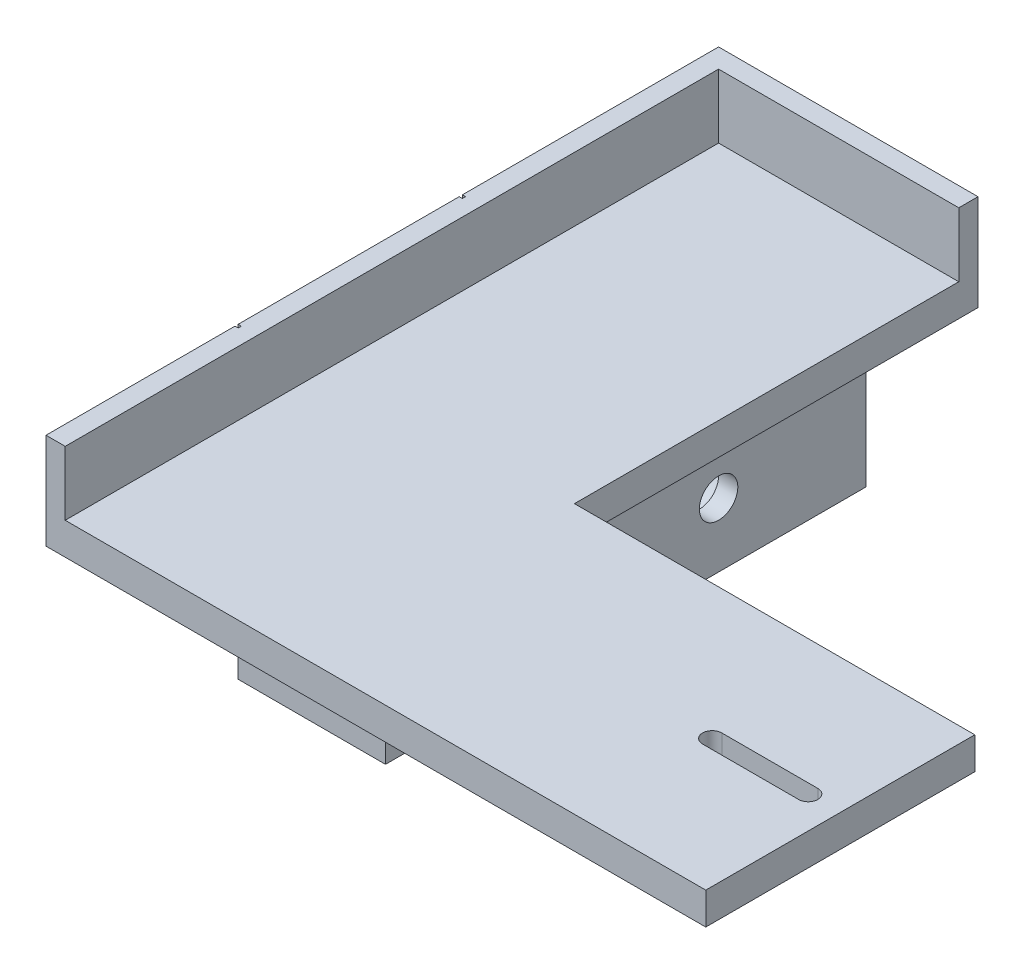
ISO-10303-21;
HEADER;
FILE_DESCRIPTION(('STEP AP214'),'2;1');
FILE_NAME('part.step','',(''),(''),'','','');
FILE_SCHEMA(('AUTOMOTIVE_DESIGN { 1 0 10303 214 1 1 1 1 }'));
ENDSEC;
DATA;
#1=APPLICATION_CONTEXT('core data for automotive mechanical design processes');
#2=APPLICATION_PROTOCOL_DEFINITION('international standard','automotive_design',2000,#1);
#3=PRODUCT_CONTEXT('',#1,'mechanical');
#4=PRODUCT('Part','Part','',(#3));
#5=PRODUCT_RELATED_PRODUCT_CATEGORY('part','',(#4));
#6=PRODUCT_DEFINITION_FORMATION('','',#4);
#7=PRODUCT_DEFINITION_CONTEXT('part definition',#1,'design');
#8=PRODUCT_DEFINITION('design','',#6,#7);
#9=PRODUCT_DEFINITION_SHAPE('','',#8);
#10=(LENGTH_UNIT() NAMED_UNIT(*) SI_UNIT(.MILLI.,.METRE.));
#11=(NAMED_UNIT(*) PLANE_ANGLE_UNIT() SI_UNIT($,.RADIAN.));
#12=(NAMED_UNIT(*) SI_UNIT($,.STERADIAN.) SOLID_ANGLE_UNIT());
#13=UNCERTAINTY_MEASURE_WITH_UNIT(LENGTH_MEASURE(1.E-05),#10,'distance_accuracy_value','');
#14=(GEOMETRIC_REPRESENTATION_CONTEXT(3) GLOBAL_UNCERTAINTY_ASSIGNED_CONTEXT((#13)) GLOBAL_UNIT_ASSIGNED_CONTEXT((#10,
#11,#12)) REPRESENTATION_CONTEXT('',''));
#15=CARTESIAN_POINT('',(0.,0.,0.));
#16=DIRECTION('',(0.,0.,1.));
#17=DIRECTION('',(1.,0.,0.));
#18=AXIS2_PLACEMENT_3D('',#15,#16,#17);
#19=CARTESIAN_POINT('',(-40.4999999999993,0.,-1.12685596148307E-12));
#20=DIRECTION('',(1.,0.,0.));
#21=DIRECTION('',(0.,0.,-1.));
#22=AXIS2_PLACEMENT_3D('',#19,#20,#21);
#23=PLANE('',#22);
#24=CARTESIAN_POINT('',(-40.4999999999977,-23.,-55.9999999999968));
#25=DIRECTION('',(-1.,0.,0.));
#26=DIRECTION('',(0.,0.,1.));
#27=AXIS2_PLACEMENT_3D('',#24,#25,#26);
#28=CIRCLE('',#27,5.);
#29=CARTESIAN_POINT('',(-40.4999999999979,-23.,-50.9999999999968));
#30=VERTEX_POINT('',#29);
#31=EDGE_CURVE('E512',#30,#30,#28,.T.);
#32=ORIENTED_EDGE('',*,*,#31,.F.);
#33=EDGE_LOOP('',(#32));
#34=FACE_BOUND('',#33,.T.);
#35=DIRECTION('',(0.,0.,1.));
#36=VECTOR('',#35,1.);
#37=CARTESIAN_POINT('',(-40.4999999999992,-33.,-4.00000000000008));
#38=LINE('',#37,#36);
#39=CARTESIAN_POINT('',(-40.4999999999974,-33.,-78.9999999999964));
#40=VERTEX_POINT('',#39);
#41=CARTESIAN_POINT('',(-40.4999999999982,-33.,-38.9999999999964));
#42=VERTEX_POINT('',#41);
#43=EDGE_CURVE('E352',#40,#42,#38,.T.);
#44=ORIENTED_EDGE('',*,*,#43,.T.);
#45=DIRECTION('',(0.,-1.,0.));
#46=VECTOR('',#45,1.);
#47=CARTESIAN_POINT('',(-40.4999999999982,15.,-38.9999999999964));
#48=LINE('',#47,#46);
#49=CARTESIAN_POINT('',(-40.4999999999982,-0.500000000000004,-38.9999999999964));
#50=VERTEX_POINT('',#49);
#51=EDGE_CURVE('E374',#50,#42,#48,.T.);
#52=ORIENTED_EDGE('',*,*,#51,.F.);
#53=DIRECTION('',(0.,0.,1.));
#54=VECTOR('',#53,1.);
#55=CARTESIAN_POINT('',(-40.4999999999992,-0.5,-4.00000000000011));
#56=LINE('',#55,#54);
#57=CARTESIAN_POINT('',(-40.4999999999971,-0.500000000000009,-78.9999999999964));
#58=VERTEX_POINT('',#57);
#59=EDGE_CURVE('E289',#58,#50,#56,.T.);
#60=ORIENTED_EDGE('',*,*,#59,.F.);
#61=DIRECTION('',(0.,1.,0.));
#62=VECTOR('',#61,1.);
#63=CARTESIAN_POINT('',(-40.4999999999974,-33.,-78.9999999999964));
#64=LINE('',#63,#62);
#65=EDGE_CURVE('E507',#40,#58,#64,.T.);
#66=ORIENTED_EDGE('',*,*,#65,.F.);
#67=EDGE_LOOP('',(#44,#52,#60,#66));
#68=FACE_BOUND('',#67,.T.);
#69=ADVANCED_FACE('F41',(#34,#68),#23,.F.);
#70=CARTESIAN_POINT('',(0.,0.,0.));
#71=DIRECTION('',(0.,1.,0.));
#72=DIRECTION('',(0.,0.,1.));
#73=AXIS2_PLACEMENT_3D('',#70,#71,#72);
#74=PLANE('',#73);
#75=DIRECTION('',(0.,0.,-1.));
#76=VECTOR('',#75,1.);
#77=CARTESIAN_POINT('',(-39.9999999999992,0.,-4.0000000000001));
#78=LINE('',#77,#76);
#79=CARTESIAN_POINT('',(-39.9999999999992,0.,-4.00000000000007));
#80=VERTEX_POINT('',#79);
#81=CARTESIAN_POINT('',(-39.9999999999982,0.,-38.4999999999964));
#82=VERTEX_POINT('',#81);
#83=EDGE_CURVE('E273',#80,#82,#78,.T.);
#84=ORIENTED_EDGE('',*,*,#83,.F.);
#85=DIRECTION('',(-1.,0.,0.));
#86=VECTOR('',#85,1.);
#87=CARTESIAN_POINT('',(-39.9999999999992,0.,-4.00000000000007));
#88=LINE('',#87,#86);
#89=CARTESIAN_POINT('',(-40.4999999999992,0.,-4.00000000000008));
#90=VERTEX_POINT('',#89);
#91=EDGE_CURVE('E243',#80,#90,#88,.T.);
#92=ORIENTED_EDGE('',*,*,#91,.T.);
#93=DIRECTION('',(0.,0.,1.));
#94=VECTOR('',#93,1.);
#95=CARTESIAN_POINT('',(-40.5,0.,25.9999999999999));
#96=LINE('',#95,#94);
#97=CARTESIAN_POINT('',(-40.4999999999982,0.,-38.4999999999964));
#98=VERTEX_POINT('',#97);
#99=EDGE_CURVE('E354',#98,#90,#96,.T.);
#100=ORIENTED_EDGE('',*,*,#99,.F.);
#101=DIRECTION('',(1.,0.,0.));
#102=VECTOR('',#101,1.);
#103=CARTESIAN_POINT('',(1.07120875350848E-12,0.,-38.4999999999953));
#104=LINE('',#103,#102);
#105=EDGE_CURVE('E276',#98,#82,#104,.T.);
#106=ORIENTED_EDGE('',*,*,#105,.T.);
#107=EDGE_LOOP('',(#84,#92,#100,#106));
#108=FACE_BOUND('',#107,.T.);
#109=ADVANCED_FACE('F275',(#108),#74,.F.);
#110=CARTESIAN_POINT('',(-39.9999999999982,0.,-38.9999999999964));
#111=VERTEX_POINT('',#110);
#112=CARTESIAN_POINT('',(-39.9999999999971,0.,-78.9999999999965));
#113=VERTEX_POINT('',#112);
#114=EDGE_CURVE('E279',#111,#113,#78,.T.);
#115=ORIENTED_EDGE('',*,*,#114,.F.);
#116=DIRECTION('',(-1.,0.,0.));
#117=VECTOR('',#116,1.);
#118=CARTESIAN_POINT('',(1.0851205555021E-12,0.,-38.9999999999953));
#119=LINE('',#118,#117);
#120=CARTESIAN_POINT('',(-40.4999999999982,0.,-38.9999999999964));
#121=VERTEX_POINT('',#120);
#122=EDGE_CURVE('E402',#111,#121,#119,.T.);
#123=ORIENTED_EDGE('',*,*,#122,.T.);
#124=CARTESIAN_POINT('',(-40.4999999999971,0.,-78.9999999999964));
#125=VERTEX_POINT('',#124);
#126=EDGE_CURVE('E355',#125,#121,#96,.T.);
#127=ORIENTED_EDGE('',*,*,#126,.F.);
#128=DIRECTION('',(-1.,0.,0.));
#129=VECTOR('',#128,1.);
#130=CARTESIAN_POINT('',(-39.9999999999971,0.,-78.9999999999964));
#131=LINE('',#130,#129);
#132=EDGE_CURVE('E410',#113,#125,#131,.T.);
#133=ORIENTED_EDGE('',*,*,#132,.F.);
#134=EDGE_LOOP('',(#115,#123,#127,#133));
#135=FACE_BOUND('',#134,.T.);
#136=ADVANCED_FACE('F549',(#135),#74,.F.);
#137=ORIENTED_EDGE('',*,*,#99,.T.);
#138=DIRECTION('',(0.,-1.,0.));
#139=VECTOR('',#138,1.);
#140=CARTESIAN_POINT('',(-40.4999999999992,0.,-4.00000000000008));
#141=LINE('',#140,#139);
#142=CARTESIAN_POINT('',(-40.4999999999992,15.,-4.00000000000008));
#143=VERTEX_POINT('',#142);
#144=EDGE_CURVE('E248',#143,#90,#141,.T.);
#145=ORIENTED_EDGE('',*,*,#144,.F.);
#146=DIRECTION('',(0.,0.,1.));
#147=VECTOR('',#146,1.);
#148=CARTESIAN_POINT('',(-40.4999999999974,15.,-78.9999999999964));
#149=LINE('',#148,#147);
#150=CARTESIAN_POINT('',(-40.4999999999982,15.,-38.4999999999964));
#151=VERTEX_POINT('',#150);
#152=EDGE_CURVE('E370',#151,#143,#149,.T.);
#153=ORIENTED_EDGE('',*,*,#152,.F.);
#154=DIRECTION('',(0.,1.,0.));
#155=VECTOR('',#154,1.);
#156=CARTESIAN_POINT('',(-40.4999999999982,15.,-38.4999999999964));
#157=LINE('',#156,#155);
#158=EDGE_CURVE('E369',#98,#151,#157,.T.);
#159=ORIENTED_EDGE('',*,*,#158,.F.);
#160=EDGE_LOOP('',(#137,#145,#153,#159));
#161=FACE_BOUND('',#160,.T.);
#162=ADVANCED_FACE('F366',(#161),#23,.F.);
#163=ORIENTED_EDGE('',*,*,#126,.T.);
#164=CARTESIAN_POINT('',(-40.4999999999982,15.,-38.9999999999964));
#165=VERTEX_POINT('',#164);
#166=EDGE_CURVE('E382',#165,#121,#48,.T.);
#167=ORIENTED_EDGE('',*,*,#166,.F.);
#168=CARTESIAN_POINT('',(-40.4999999999974,15.,-78.9999999999964));
#169=VERTEX_POINT('',#168);
#170=EDGE_CURVE('E474',#169,#165,#149,.T.);
#171=ORIENTED_EDGE('',*,*,#170,.F.);
#172=EDGE_CURVE('E506',#125,#169,#64,.T.);
#173=ORIENTED_EDGE('',*,*,#172,.F.);
#174=EDGE_LOOP('',(#163,#167,#171,#173));
#175=FACE_BOUND('',#174,.T.);
#176=ADVANCED_FACE('F539',(#175),#23,.F.);
#177=CARTESIAN_POINT('',(-39.9999999999992,-0.5,-4.0000000000001));
#178=DIRECTION('',(0.,-1.,0.));
#179=DIRECTION('',(0.,0.,-1.));
#180=AXIS2_PLACEMENT_3D('',#177,#178,#179);
#181=PLANE('',#180);
#182=ORIENTED_EDGE('',*,*,#59,.T.);
#183=DIRECTION('',(1.,0.,0.));
#184=VECTOR('',#183,1.);
#185=CARTESIAN_POINT('',(-39.9999999999982,-0.500000000000004,-38.9999999999964));
#186=LINE('',#185,#184);
#187=CARTESIAN_POINT('',(-39.9999999999982,-0.500000000000009,-38.9999999999964));
#188=VERTEX_POINT('',#187);
#189=EDGE_CURVE('E399',#50,#188,#186,.T.);
#190=ORIENTED_EDGE('',*,*,#189,.T.);
#191=DIRECTION('',(0.,0.,1.));
#192=VECTOR('',#191,1.);
#193=CARTESIAN_POINT('',(-39.9999999999992,-0.5,-4.0000000000001));
#194=LINE('',#193,#192);
#195=CARTESIAN_POINT('',(-39.9999999999971,-0.500000000000009,-78.9999999999964));
#196=VERTEX_POINT('',#195);
#197=EDGE_CURVE('E407',#196,#188,#194,.T.);
#198=ORIENTED_EDGE('',*,*,#197,.F.);
#199=DIRECTION('',(-1.,0.,0.));
#200=VECTOR('',#199,1.);
#201=CARTESIAN_POINT('',(-39.9999999999971,-0.500000000000009,-78.9999999999964));
#202=LINE('',#201,#200);
#203=EDGE_CURVE('E415',#196,#58,#202,.T.);
#204=ORIENTED_EDGE('',*,*,#203,.T.);
#205=EDGE_LOOP('',(#182,#190,#198,#204));
#206=FACE_BOUND('',#205,.T.);
#207=ADVANCED_FACE('F527',(#206),#181,.F.);
#208=CARTESIAN_POINT('',(-40.4999999999986,-23.,-24.0000000000001));
#209=DIRECTION('',(-1.,0.,0.));
#210=DIRECTION('',(0.,0.,1.));
#211=AXIS2_PLACEMENT_3D('',#208,#209,#210);
#212=CIRCLE('',#211,5.);
#213=CARTESIAN_POINT('',(-40.4999999999987,-23.,-19.0000000000001));
#214=VERTEX_POINT('',#213);
#215=EDGE_CURVE('E510',#214,#214,#212,.T.);
#216=ORIENTED_EDGE('',*,*,#215,.F.);
#217=EDGE_LOOP('',(#216));
#218=FACE_BOUND('',#217,.T.);
#219=CARTESIAN_POINT('',(-40.4999999999982,-0.500000000000004,-38.4999999999964));
#220=VERTEX_POINT('',#219);
#221=CARTESIAN_POINT('',(-40.4999999999992,-0.5,-4.00000000000011));
#222=VERTEX_POINT('',#221);
#223=EDGE_CURVE('E404',#220,#222,#56,.T.);
#224=ORIENTED_EDGE('',*,*,#223,.F.);
#225=CARTESIAN_POINT('',(-40.4999999999982,-33.,-38.4999999999964));
#226=VERTEX_POINT('',#225);
#227=EDGE_CURVE('E371',#226,#220,#157,.T.);
#228=ORIENTED_EDGE('',*,*,#227,.F.);
#229=CARTESIAN_POINT('',(-40.4999999999992,-33.,-4.00000000000008));
#230=VERTEX_POINT('',#229);
#231=EDGE_CURVE('E344',#226,#230,#38,.T.);
#232=ORIENTED_EDGE('',*,*,#231,.T.);
#233=DIRECTION('',(0.,1.,0.));
#234=VECTOR('',#233,1.);
#235=CARTESIAN_POINT('',(-40.4999999999992,0.,-4.00000000000011));
#236=LINE('',#235,#234);
#237=EDGE_CURVE('E347',#230,#222,#236,.T.);
#238=ORIENTED_EDGE('',*,*,#237,.T.);
#239=EDGE_LOOP('',(#224,#228,#232,#238));
#240=FACE_BOUND('',#239,.T.);
#241=ADVANCED_FACE('F517',(#218,#240),#23,.F.);
#242=CARTESIAN_POINT('',(-7.49999999999861,-23.,-23.9999999999992));
#243=DIRECTION('',(-1.,0.,0.));
#244=DIRECTION('',(0.,0.,1.));
#245=AXIS2_PLACEMENT_3D('',#242,#243,#244);
#246=CYLINDRICAL_SURFACE('',#245,3.);
#247=CARTESIAN_POINT('',(-17.4999999999972,-23.,-23.9999999999994));
#248=DIRECTION('',(-1.,0.,0.));
#249=DIRECTION('',(0.,0.,1.));
#250=AXIS2_PLACEMENT_3D('',#247,#248,#249);
#251=CIRCLE('',#250,3.);
#252=CARTESIAN_POINT('',(-17.4999999999972,-23.,-20.9999999999994));
#253=VERTEX_POINT('',#252);
#254=EDGE_CURVE('E317',#253,#253,#251,.T.);
#255=ORIENTED_EDGE('',*,*,#254,.F.);
#256=EDGE_LOOP('',(#255));
#257=FACE_BOUND('',#256,.T.);
#258=CARTESIAN_POINT('',(-20.4999999999986,-23.,-23.9999999999995));
#259=DIRECTION('',(-1.,0.,0.));
#260=DIRECTION('',(0.,0.,1.));
#261=AXIS2_PLACEMENT_3D('',#258,#259,#260);
#262=CIRCLE('',#261,3.);
#263=CARTESIAN_POINT('',(-20.4999999999987,-23.,-20.9999999999995));
#264=VERTEX_POINT('',#263);
#265=EDGE_CURVE('E45',#264,#264,#262,.F.);
#266=ORIENTED_EDGE('',*,*,#265,.F.);
#267=EDGE_LOOP('',(#266));
#268=FACE_BOUND('',#267,.T.);
#269=ADVANCED_FACE('F570',(#257,#268),#246,.F.);
#270=CARTESIAN_POINT('',(-7.49999999999772,-23.,-55.9999999999958));
#271=DIRECTION('',(-1.,0.,0.));
#272=DIRECTION('',(0.,0.,1.));
#273=AXIS2_PLACEMENT_3D('',#270,#271,#272);
#274=CYLINDRICAL_SURFACE('',#273,3.);
#275=CARTESIAN_POINT('',(-17.4999999999972,-23.,-55.9999999999961));
#276=DIRECTION('',(-1.,0.,0.));
#277=DIRECTION('',(0.,0.,1.));
#278=AXIS2_PLACEMENT_3D('',#275,#276,#277);
#279=CIRCLE('',#278,3.);
#280=CARTESIAN_POINT('',(-17.4999999999972,-23.,-52.9999999999961));
#281=VERTEX_POINT('',#280);
#282=EDGE_CURVE('E301',#281,#281,#279,.T.);
#283=ORIENTED_EDGE('',*,*,#282,.F.);
#284=EDGE_LOOP('',(#283));
#285=FACE_BOUND('',#284,.T.);
#286=CARTESIAN_POINT('',(-20.4999999999977,-23.,-55.9999999999962));
#287=DIRECTION('',(-1.,0.,0.));
#288=DIRECTION('',(0.,0.,1.));
#289=AXIS2_PLACEMENT_3D('',#286,#287,#288);
#290=CIRCLE('',#289,3.);
#291=CARTESIAN_POINT('',(-20.4999999999978,-23.,-52.9999999999962));
#292=VERTEX_POINT('',#291);
#293=EDGE_CURVE('E321',#292,#292,#290,.F.);
#294=ORIENTED_EDGE('',*,*,#293,.F.);
#295=EDGE_LOOP('',(#294));
#296=FACE_BOUND('',#295,.T.);
#297=ADVANCED_FACE('F576',(#285,#296),#274,.F.);
#298=DIRECTION('',(-1.,0.,0.));
#299=VECTOR('',#298,1.);
#300=CARTESIAN_POINT('',(-2.90320429733349E-13,0.,3.49999999999649));
#301=LINE('',#300,#299);
#302=CARTESIAN_POINT('',(57.5000000000023,0.,3.50000000000126));
#303=VERTEX_POINT('',#302);
#304=CARTESIAN_POINT('',(42.5,0.,3.50000000000001));
#305=VERTEX_POINT('',#304);
#306=EDGE_CURVE('E444',#303,#305,#301,.T.);
#307=ORIENTED_EDGE('',*,*,#306,.T.);
#308=CARTESIAN_POINT('',(42.5,0.,4.99999999999773));
#309=DIRECTION('',(0.,1.,0.));
#310=DIRECTION('',(0.,0.,1.));
#311=AXIS2_PLACEMENT_3D('',#308,#309,#310);
#312=CIRCLE('',#311,1.5000000000042);
#313=CARTESIAN_POINT('',(42.4999999999949,0.,6.50000000000842));
#314=VERTEX_POINT('',#313);
#315=EDGE_CURVE('E447',#305,#314,#312,.T.);
#316=ORIENTED_EDGE('',*,*,#315,.T.);
#317=DIRECTION('',(1.,0.,-9.47505962578209E-13));
#318=VECTOR('',#317,1.);
#319=CARTESIAN_POINT('',(6.15878875680449E-12,0.,6.50000000004869));
#320=LINE('',#319,#318);
#321=CARTESIAN_POINT('',(57.5,0.,6.4999999999942));
#322=VERTEX_POINT('',#321);
#323=EDGE_CURVE('E432',#314,#322,#320,.T.);
#324=ORIENTED_EDGE('',*,*,#323,.T.);
#325=CARTESIAN_POINT('',(57.5,0.,4.99999999999773));
#326=DIRECTION('',(0.,1.,0.));
#327=DIRECTION('',(0.,0.,1.));
#328=AXIS2_PLACEMENT_3D('',#325,#326,#327);
#329=CIRCLE('',#328,1.49999999999647);
#330=EDGE_CURVE('E441',#322,#303,#329,.T.);
#331=ORIENTED_EDGE('',*,*,#330,.T.);
#332=EDGE_LOOP('',(#307,#316,#324,#331));
#333=FACE_BOUND('',#332,.T.);
#334=CARTESIAN_POINT('',(-40.4999999999992,0.,-3.50000000000008));
#335=VERTEX_POINT('',#334);
#336=CARTESIAN_POINT('',(-40.5,0.,25.9999999999999));
#337=VERTEX_POINT('',#336);
#338=EDGE_CURVE('E351',#335,#337,#96,.T.);
#339=ORIENTED_EDGE('',*,*,#338,.F.);
#340=DIRECTION('',(-1.,0.,0.));
#341=VECTOR('',#340,1.);
#342=CARTESIAN_POINT('',(-39.9999999999992,0.,-3.50000000000007));
#343=LINE('',#342,#341);
#344=CARTESIAN_POINT('',(-39.9999999999992,0.,-3.50000000000007));
#345=VERTEX_POINT('',#344);
#346=EDGE_CURVE('E253',#345,#335,#343,.T.);
#347=ORIENTED_EDGE('',*,*,#346,.F.);
#348=DIRECTION('',(0.,0.,1.));
#349=VECTOR('',#348,1.);
#350=CARTESIAN_POINT('',(-39.9999999999992,0.,-4.00000000000007));
#351=LINE('',#350,#349);
#352=EDGE_CURVE('E258',#80,#345,#351,.T.);
#353=ORIENTED_EDGE('',*,*,#352,.F.);
#354=DIRECTION('',(-1.,0.,0.));
#355=VECTOR('',#354,1.);
#356=CARTESIAN_POINT('',(-37.4999999999972,0.,-4.));
#357=LINE('',#356,#355);
#358=CARTESIAN_POINT('',(-17.4999999999972,0.,-4.));
#359=VERTEX_POINT('',#358);
#360=EDGE_CURVE('E268',#359,#80,#357,.T.);
#361=ORIENTED_EDGE('',*,*,#360,.F.);
#362=DIRECTION('',(0.,0.,1.));
#363=VECTOR('',#362,1.);
#364=CARTESIAN_POINT('',(-17.4999999999972,0.,-4.));
#365=LINE('',#364,#363);
#366=CARTESIAN_POINT('',(-17.4999999999974,0.,-78.9999999999985));
#367=VERTEX_POINT('',#366);
#368=EDGE_CURVE('E297',#367,#359,#365,.T.);
#369=ORIENTED_EDGE('',*,*,#368,.F.);
#370=DIRECTION('',(-1.,0.,0.));
#371=VECTOR('',#370,1.);
#372=CARTESIAN_POINT('',(-6.98737364264972E-12,0.,-79.));
#373=LINE('',#372,#371);
#374=CARTESIAN_POINT('',(-6.98737364264972E-12,0.,-79.));
#375=VERTEX_POINT('',#374);
#376=EDGE_CURVE('E497',#375,#367,#373,.T.);
#377=ORIENTED_EDGE('',*,*,#376,.F.);
#378=DIRECTION('',(0.,0.,-1.));
#379=VECTOR('',#378,1.);
#380=CARTESIAN_POINT('',(0.,0.,-16.));
#381=LINE('',#380,#379);
#382=CARTESIAN_POINT('',(0.,0.,-16.));
#383=VERTEX_POINT('',#382);
#384=EDGE_CURVE('E310',#383,#375,#381,.T.);
#385=ORIENTED_EDGE('',*,*,#384,.F.);
#386=DIRECTION('',(-1.,0.,0.));
#387=VECTOR('',#386,1.);
#388=CARTESIAN_POINT('',(37.5,0.,-16.));
#389=LINE('',#388,#387);
#390=CARTESIAN_POINT('',(62.5,0.,-16.));
#391=VERTEX_POINT('',#390);
#392=EDGE_CURVE('E314',#391,#383,#389,.T.);
#393=ORIENTED_EDGE('',*,*,#392,.F.);
#394=DIRECTION('',(0.,0.,-1.));
#395=VECTOR('',#394,1.);
#396=CARTESIAN_POINT('',(62.5,0.,26.));
#397=LINE('',#396,#395);
#398=CARTESIAN_POINT('',(62.5,0.,26.));
#399=VERTEX_POINT('',#398);
#400=EDGE_CURVE('E453',#399,#391,#397,.T.);
#401=ORIENTED_EDGE('',*,*,#400,.F.);
#402=DIRECTION('',(1.,0.,0.));
#403=VECTOR('',#402,1.);
#404=CARTESIAN_POINT('',(-37.5,0.,26.));
#405=LINE('',#404,#403);
#406=EDGE_CURVE('E306',#337,#399,#405,.T.);
#407=ORIENTED_EDGE('',*,*,#406,.F.);
#408=EDGE_LOOP('',(#339,#347,#353,#361,#369,#377,#385,#393,#401,#407));
#409=FACE_BOUND('',#408,.T.);
#410=ADVANCED_FACE('F266',(#333,#409),#74,.F.);
#411=CARTESIAN_POINT('',(-37.5,5.,26.));
#412=DIRECTION('',(0.,0.,-1.));
#413=DIRECTION('',(-1.,0.,0.));
#414=AXIS2_PLACEMENT_3D('',#411,#412,#413);
#415=PLANE('',#414);
#416=ORIENTED_EDGE('',*,*,#406,.T.);
#417=DIRECTION('',(0.,-1.,0.));
#418=VECTOR('',#417,1.);
#419=CARTESIAN_POINT('',(62.5,5.,26.));
#420=LINE('',#419,#418);
#421=CARTESIAN_POINT('',(62.5,5.,26.));
#422=VERTEX_POINT('',#421);
#423=EDGE_CURVE('E450',#422,#399,#420,.T.);
#424=ORIENTED_EDGE('',*,*,#423,.F.);
#425=DIRECTION('',(1.,0.,0.));
#426=VECTOR('',#425,1.);
#427=CARTESIAN_POINT('',(-37.5,5.,26.));
#428=LINE('',#427,#426);
#429=CARTESIAN_POINT('',(-37.4999999999974,5.,26.));
#430=VERTEX_POINT('',#429);
#431=EDGE_CURVE('E307',#430,#422,#428,.T.);
#432=ORIENTED_EDGE('',*,*,#431,.F.);
#433=DIRECTION('',(0.,-1.,0.));
#434=VECTOR('',#433,1.);
#435=CARTESIAN_POINT('',(-37.4999999999974,15.,25.9999999999999));
#436=LINE('',#435,#434);
#437=CARTESIAN_POINT('',(-37.4999999999974,15.,25.9999999999999));
#438=VERTEX_POINT('',#437);
#439=EDGE_CURVE('E488',#438,#430,#436,.T.);
#440=ORIENTED_EDGE('',*,*,#439,.F.);
#441=DIRECTION('',(1.,0.,0.));
#442=VECTOR('',#441,1.);
#443=CARTESIAN_POINT('',(-40.5,15.,25.9999999999999));
#444=LINE('',#443,#442);
#445=CARTESIAN_POINT('',(-40.5,15.,25.9999999999999));
#446=VERTEX_POINT('',#445);
#447=EDGE_CURVE('E477',#446,#438,#444,.T.);
#448=ORIENTED_EDGE('',*,*,#447,.F.);
#449=DIRECTION('',(0.,1.,0.));
#450=VECTOR('',#449,1.);
#451=CARTESIAN_POINT('',(-40.5,5.,25.9999999999999));
#452=LINE('',#451,#450);
#453=EDGE_CURVE('E333',#337,#446,#452,.T.);
#454=ORIENTED_EDGE('',*,*,#453,.F.);
#455=EDGE_LOOP('',(#416,#424,#432,#440,#448,#454));
#456=FACE_BOUND('',#455,.T.);
#457=ADVANCED_FACE('F43',(#456),#415,.F.);
#458=CARTESIAN_POINT('',(37.5,5.,-16.));
#459=DIRECTION('',(0.,0.,1.));
#460=DIRECTION('',(1.,0.,0.));
#461=AXIS2_PLACEMENT_3D('',#458,#459,#460);
#462=PLANE('',#461);
#463=ORIENTED_EDGE('',*,*,#392,.T.);
#464=DIRECTION('',(0.,-1.,0.));
#465=VECTOR('',#464,1.);
#466=CARTESIAN_POINT('',(0.,5.,-16.));
#467=LINE('',#466,#465);
#468=CARTESIAN_POINT('',(0.,5.,-16.));
#469=VERTEX_POINT('',#468);
#470=EDGE_CURVE('E11',#469,#383,#467,.T.);
#471=ORIENTED_EDGE('',*,*,#470,.F.);
#472=DIRECTION('',(-1.,0.,0.));
#473=VECTOR('',#472,1.);
#474=CARTESIAN_POINT('',(37.5,5.,-16.));
#475=LINE('',#474,#473);
#476=CARTESIAN_POINT('',(62.5,5.,-16.));
#477=VERTEX_POINT('',#476);
#478=EDGE_CURVE('E309',#477,#469,#475,.T.);
#479=ORIENTED_EDGE('',*,*,#478,.F.);
#480=DIRECTION('',(0.,1.,0.));
#481=VECTOR('',#480,1.);
#482=CARTESIAN_POINT('',(62.5,5.,-16.));
#483=LINE('',#482,#481);
#484=EDGE_CURVE('E456',#391,#477,#483,.T.);
#485=ORIENTED_EDGE('',*,*,#484,.F.);
#486=EDGE_LOOP('',(#463,#471,#479,#485));
#487=FACE_BOUND('',#486,.T.);
#488=ADVANCED_FACE('F789',(#487),#462,.F.);
#489=CARTESIAN_POINT('',(0.,5.,-16.));
#490=DIRECTION('',(-1.,0.,0.));
#491=DIRECTION('',(0.,0.,1.));
#492=AXIS2_PLACEMENT_3D('',#489,#490,#491);
#493=PLANE('',#492);
#494=ORIENTED_EDGE('',*,*,#384,.T.);
#495=DIRECTION('',(-1.34362544238867E-12,-1.,0.));
#496=VECTOR('',#495,1.);
#497=CARTESIAN_POINT('',(-2.6924643070638E-13,5.,-79.));
#498=LINE('',#497,#496);
#499=CARTESIAN_POINT('',(-2.6924643070638E-13,15.,-79.));
#500=VERTEX_POINT('',#499);
#501=EDGE_CURVE('E494',#500,#375,#498,.T.);
#502=ORIENTED_EDGE('',*,*,#501,.F.);
#503=DIRECTION('',(0.,0.,-1.));
#504=VECTOR('',#503,1.);
#505=CARTESIAN_POINT('',(0.,15.,-76.));
#506=LINE('',#505,#504);
#507=CARTESIAN_POINT('',(0.,15.,-76.));
#508=VERTEX_POINT('',#507);
#509=EDGE_CURVE('E466',#508,#500,#506,.T.);
#510=ORIENTED_EDGE('',*,*,#509,.F.);
#511=DIRECTION('',(0.,-1.,0.));
#512=VECTOR('',#511,1.);
#513=CARTESIAN_POINT('',(0.,15.,-76.));
#514=LINE('',#513,#512);
#515=CARTESIAN_POINT('',(0.,5.,-76.));
#516=VERTEX_POINT('',#515);
#517=EDGE_CURVE('E491',#508,#516,#514,.T.);
#518=ORIENTED_EDGE('',*,*,#517,.T.);
#519=DIRECTION('',(0.,0.,-1.));
#520=VECTOR('',#519,1.);
#521=CARTESIAN_POINT('',(0.,5.,-16.));
#522=LINE('',#521,#520);
#523=EDGE_CURVE('E50',#469,#516,#522,.T.);
#524=ORIENTED_EDGE('',*,*,#523,.F.);
#525=ORIENTED_EDGE('',*,*,#470,.T.);
#526=EDGE_LOOP('',(#494,#502,#510,#518,#524,#525));
#527=FACE_BOUND('',#526,.T.);
#528=ADVANCED_FACE('F779',(#527),#493,.F.);
#529=CARTESIAN_POINT('',(0.,5.,0.));
#530=DIRECTION('',(0.,1.,0.));
#531=DIRECTION('',(0.,0.,1.));
#532=AXIS2_PLACEMENT_3D('',#529,#530,#531);
#533=PLANE('',#532);
#534=CARTESIAN_POINT('',(42.5,5.,4.99999999999773));
#535=DIRECTION('',(0.,1.,0.));
#536=DIRECTION('',(0.,0.,-1.));
#537=AXIS2_PLACEMENT_3D('',#534,#535,#536);
#538=CIRCLE('',#537,1.5000000000042);
#539=CARTESIAN_POINT('',(42.5,5.,3.50000000000001));
#540=VERTEX_POINT('',#539);
#541=CARTESIAN_POINT('',(42.4999999999949,5.,6.50000000000842));
#542=VERTEX_POINT('',#541);
#543=EDGE_CURVE('E414',#540,#542,#538,.T.);
#544=ORIENTED_EDGE('',*,*,#543,.F.);
#545=DIRECTION('',(-1.,0.,0.));
#546=VECTOR('',#545,1.);
#547=CARTESIAN_POINT('',(57.5000000000023,5.,3.50000000000125));
#548=LINE('',#547,#546);
#549=CARTESIAN_POINT('',(57.5000000000023,5.,3.50000000000126));
#550=VERTEX_POINT('',#549);
#551=EDGE_CURVE('E426',#550,#540,#548,.T.);
#552=ORIENTED_EDGE('',*,*,#551,.F.);
#553=CARTESIAN_POINT('',(57.5,5.,4.99999999999773));
#554=DIRECTION('',(0.,1.,0.));
#555=DIRECTION('',(0.,0.,-1.));
#556=AXIS2_PLACEMENT_3D('',#553,#554,#555);
#557=CIRCLE('',#556,1.49999999999647);
#558=CARTESIAN_POINT('',(57.5,5.,6.4999999999942));
#559=VERTEX_POINT('',#558);
#560=EDGE_CURVE('E423',#559,#550,#557,.T.);
#561=ORIENTED_EDGE('',*,*,#560,.F.);
#562=DIRECTION('',(1.,0.,-9.47505962578209E-13));
#563=VECTOR('',#562,1.);
#564=CARTESIAN_POINT('',(42.4999999999949,5.,6.50000000000842));
#565=LINE('',#564,#563);
#566=EDGE_CURVE('E420',#542,#559,#565,.T.);
#567=ORIENTED_EDGE('',*,*,#566,.F.);
#568=EDGE_LOOP('',(#544,#552,#561,#567));
#569=FACE_BOUND('',#568,.T.);
#570=DIRECTION('',(1.,0.,0.));
#571=VECTOR('',#570,1.);
#572=CARTESIAN_POINT('',(-37.4999999999974,5.,-76.));
#573=LINE('',#572,#571);
#574=CARTESIAN_POINT('',(-37.4999999999974,5.,-76.));
#575=VERTEX_POINT('',#574);
#576=EDGE_CURVE('E462',#575,#516,#573,.T.);
#577=ORIENTED_EDGE('',*,*,#576,.F.);
#578=DIRECTION('',(0.,0.,-1.));
#579=VECTOR('',#578,1.);
#580=CARTESIAN_POINT('',(-37.4999999999974,5.,25.9999999999999));
#581=LINE('',#580,#579);
#582=EDGE_CURVE('E467',#430,#575,#581,.T.);
#583=ORIENTED_EDGE('',*,*,#582,.F.);
#584=ORIENTED_EDGE('',*,*,#431,.T.);
#585=DIRECTION('',(0.,0.,1.));
#586=VECTOR('',#585,1.);
#587=CARTESIAN_POINT('',(62.5,5.,26.));
#588=LINE('',#587,#586);
#589=EDGE_CURVE('E459',#477,#422,#588,.T.);
#590=ORIENTED_EDGE('',*,*,#589,.F.);
#591=ORIENTED_EDGE('',*,*,#478,.T.);
#592=ORIENTED_EDGE('',*,*,#523,.T.);
#593=EDGE_LOOP('',(#577,#583,#584,#590,#591,#592));
#594=FACE_BOUND('',#593,.T.);
#595=ADVANCED_FACE('F760',(#569,#594),#533,.T.);
#596=CARTESIAN_POINT('',(-17.4999999999972,-33.,-4.));
#597=DIRECTION('',(-1.,0.,0.));
#598=DIRECTION('',(0.,0.,1.));
#599=AXIS2_PLACEMENT_3D('',#596,#597,#598);
#600=PLANE('',#599);
#601=ORIENTED_EDGE('',*,*,#282,.T.);
#602=EDGE_LOOP('',(#601));
#603=FACE_BOUND('',#602,.T.);
#604=ORIENTED_EDGE('',*,*,#254,.T.);
#605=EDGE_LOOP('',(#604));
#606=FACE_BOUND('',#605,.T.);
#607=ORIENTED_EDGE('',*,*,#368,.T.);
#608=DIRECTION('',(0.,1.,0.));
#609=VECTOR('',#608,1.);
#610=CARTESIAN_POINT('',(-17.4999999999972,-33.,-4.));
#611=LINE('',#610,#609);
#612=CARTESIAN_POINT('',(-17.4999999999972,-33.,-4.));
#613=VERTEX_POINT('',#612);
#614=EDGE_CURVE('E295',#613,#359,#611,.T.);
#615=ORIENTED_EDGE('',*,*,#614,.F.);
#616=DIRECTION('',(0.,0.,1.));
#617=VECTOR('',#616,1.);
#618=CARTESIAN_POINT('',(-17.4999999999972,-33.,-4.));
#619=LINE('',#618,#617);
#620=CARTESIAN_POINT('',(-17.4999999999974,-33.,-78.9999999999985));
#621=VERTEX_POINT('',#620);
#622=EDGE_CURVE('E296',#621,#613,#619,.T.);
#623=ORIENTED_EDGE('',*,*,#622,.F.);
#624=DIRECTION('',(0.,-1.,0.));
#625=VECTOR('',#624,1.);
#626=CARTESIAN_POINT('',(-17.4999999999974,0.,-78.9999999999985));
#627=LINE('',#626,#625);
#628=EDGE_CURVE('E500',#367,#621,#627,.T.);
#629=ORIENTED_EDGE('',*,*,#628,.F.);
#630=EDGE_LOOP('',(#607,#615,#623,#629));
#631=FACE_BOUND('',#630,.T.);
#632=ADVANCED_FACE('F751',(#603,#606,#631),#600,.F.);
#633=CARTESIAN_POINT('',(-37.4999999999972,-33.,-4.));
#634=DIRECTION('',(0.,0.,-1.));
#635=DIRECTION('',(-1.,0.,0.));
#636=AXIS2_PLACEMENT_3D('',#633,#634,#635);
#637=PLANE('',#636);
#638=DIRECTION('',(0.,1.,0.));
#639=VECTOR('',#638,1.);
#640=CARTESIAN_POINT('',(-39.9999999999992,0.,-4.0000000000001));
#641=LINE('',#640,#639);
#642=CARTESIAN_POINT('',(-39.9999999999992,-0.5,-4.0000000000001));
#643=VERTEX_POINT('',#642);
#644=EDGE_CURVE('E282',#643,#80,#641,.T.);
#645=ORIENTED_EDGE('',*,*,#644,.F.);
#646=DIRECTION('',(-1.,0.,0.));
#647=VECTOR('',#646,1.);
#648=CARTESIAN_POINT('',(-39.9999999999992,-0.5,-4.0000000000001));
#649=LINE('',#648,#647);
#650=EDGE_CURVE('E348',#643,#222,#649,.T.);
#651=ORIENTED_EDGE('',*,*,#650,.T.);
#652=ORIENTED_EDGE('',*,*,#237,.F.);
#653=DIRECTION('',(-1.,0.,0.));
#654=VECTOR('',#653,1.);
#655=CARTESIAN_POINT('',(-37.4999999999972,-33.,-4.));
#656=LINE('',#655,#654);
#657=EDGE_CURVE('E299',#613,#230,#656,.T.);
#658=ORIENTED_EDGE('',*,*,#657,.F.);
#659=ORIENTED_EDGE('',*,*,#614,.T.);
#660=ORIENTED_EDGE('',*,*,#360,.T.);
#661=EDGE_LOOP('',(#645,#651,#652,#658,#659,#660));
#662=FACE_BOUND('',#661,.T.);
#663=ADVANCED_FACE('F292',(#662),#637,.F.);
#664=CARTESIAN_POINT('',(0.,-33.,0.));
#665=DIRECTION('',(0.,-1.,0.));
#666=DIRECTION('',(0.,0.,-1.));
#667=AXIS2_PLACEMENT_3D('',#664,#665,#666);
#668=PLANE('',#667);
#669=DIRECTION('',(-1.,0.,0.));
#670=VECTOR('',#669,1.);
#671=CARTESIAN_POINT('',(-39.9999999999982,-33.,-38.9999999999964));
#672=LINE('',#671,#670);
#673=CARTESIAN_POINT('',(-39.9999999999982,-33.,-38.9999999999964));
#674=VERTEX_POINT('',#673);
#675=EDGE_CURVE('E388',#674,#42,#672,.T.);
#676=ORIENTED_EDGE('',*,*,#675,.T.);
#677=ORIENTED_EDGE('',*,*,#43,.F.);
#678=DIRECTION('',(-1.,0.,0.));
#679=VECTOR('',#678,1.);
#680=CARTESIAN_POINT('',(-17.4999999999974,-33.,-78.9999999999985));
#681=LINE('',#680,#679);
#682=EDGE_CURVE('E503',#621,#40,#681,.T.);
#683=ORIENTED_EDGE('',*,*,#682,.F.);
#684=ORIENTED_EDGE('',*,*,#622,.T.);
#685=ORIENTED_EDGE('',*,*,#657,.T.);
#686=ORIENTED_EDGE('',*,*,#231,.F.);
#687=DIRECTION('',(-1.,0.,0.));
#688=VECTOR('',#687,1.);
#689=CARTESIAN_POINT('',(-39.9999999999982,-33.,-38.4999999999964));
#690=LINE('',#689,#688);
#691=CARTESIAN_POINT('',(-39.9999999999982,-33.,-38.4999999999964));
#692=VERTEX_POINT('',#691);
#693=EDGE_CURVE('E521',#692,#226,#690,.T.);
#694=ORIENTED_EDGE('',*,*,#693,.F.);
#695=DIRECTION('',(0.,0.,1.));
#696=VECTOR('',#695,1.);
#697=CARTESIAN_POINT('',(-39.9999999999982,-33.,-38.9999999999964));
#698=LINE('',#697,#696);
#699=EDGE_CURVE('E391',#674,#692,#698,.T.);
#700=ORIENTED_EDGE('',*,*,#699,.F.);
#701=EDGE_LOOP('',(#676,#677,#683,#684,#685,#686,#694,#700));
#702=FACE_BOUND('',#701,.T.);
#703=ADVANCED_FACE('F342',(#702),#668,.T.);
#704=CARTESIAN_POINT('',(-20.4999999999977,-23.,-55.9999999999962));
#705=DIRECTION('',(-1.,0.,0.));
#706=DIRECTION('',(0.,0.,1.));
#707=AXIS2_PLACEMENT_3D('',#704,#705,#706);
#708=PLANE('',#707);
#709=CARTESIAN_POINT('',(-20.4999999999977,-23.,-55.9999999999962));
#710=DIRECTION('',(-1.,0.,0.));
#711=DIRECTION('',(0.,0.,1.));
#712=AXIS2_PLACEMENT_3D('',#709,#710,#711);
#713=CIRCLE('',#712,5.);
#714=CARTESIAN_POINT('',(-20.4999999999979,-23.,-50.9999999999962));
#715=VERTEX_POINT('',#714);
#716=EDGE_CURVE('E323',#715,#715,#713,.T.);
#717=ORIENTED_EDGE('',*,*,#716,.T.);
#718=EDGE_LOOP('',(#717));
#719=FACE_BOUND('',#718,.T.);
#720=ORIENTED_EDGE('',*,*,#293,.T.);
#721=EDGE_LOOP('',(#720));
#722=FACE_BOUND('',#721,.T.);
#723=ADVANCED_FACE('F713',(#719,#722),#708,.T.);
#724=CARTESIAN_POINT('',(-20.4999999999977,-23.,-55.9999999999962));
#725=DIRECTION('',(-1.,0.,0.));
#726=DIRECTION('',(0.,0.,1.));
#727=AXIS2_PLACEMENT_3D('',#724,#725,#726);
#728=CYLINDRICAL_SURFACE('',#727,5.);
#729=ORIENTED_EDGE('',*,*,#716,.F.);
#730=EDGE_LOOP('',(#729));
#731=FACE_BOUND('',#730,.T.);
#732=ORIENTED_EDGE('',*,*,#31,.T.);
#733=EDGE_LOOP('',(#732));
#734=FACE_BOUND('',#733,.T.);
#735=ADVANCED_FACE('F704',(#731,#734),#728,.F.);
#736=CARTESIAN_POINT('',(-20.4999999999986,-23.,-23.9999999999995));
#737=DIRECTION('',(-1.,0.,0.));
#738=DIRECTION('',(0.,0.,1.));
#739=AXIS2_PLACEMENT_3D('',#736,#737,#738);
#740=PLANE('',#739);
#741=CARTESIAN_POINT('',(-20.4999999999986,-23.,-23.9999999999995));
#742=DIRECTION('',(-1.,0.,0.));
#743=DIRECTION('',(0.,0.,1.));
#744=AXIS2_PLACEMENT_3D('',#741,#742,#743);
#745=CIRCLE('',#744,5.);
#746=CARTESIAN_POINT('',(-20.4999999999987,-23.,-18.9999999999995));
#747=VERTEX_POINT('',#746);
#748=EDGE_CURVE('E328',#747,#747,#745,.T.);
#749=ORIENTED_EDGE('',*,*,#748,.T.);
#750=EDGE_LOOP('',(#749));
#751=FACE_BOUND('',#750,.T.);
#752=ORIENTED_EDGE('',*,*,#265,.T.);
#753=EDGE_LOOP('',(#752));
#754=FACE_BOUND('',#753,.T.);
#755=ADVANCED_FACE('F565',(#751,#754),#740,.T.);
#756=CARTESIAN_POINT('',(-20.4999999999986,-23.,-23.9999999999995));
#757=DIRECTION('',(-1.,0.,0.));
#758=DIRECTION('',(0.,0.,1.));
#759=AXIS2_PLACEMENT_3D('',#756,#757,#758);
#760=CYLINDRICAL_SURFACE('',#759,5.);
#761=ORIENTED_EDGE('',*,*,#748,.F.);
#762=EDGE_LOOP('',(#761));
#763=FACE_BOUND('',#762,.T.);
#764=ORIENTED_EDGE('',*,*,#215,.T.);
#765=EDGE_LOOP('',(#764));
#766=FACE_BOUND('',#765,.T.);
#767=ADVANCED_FACE('F557',(#763,#766),#760,.F.);
#768=CARTESIAN_POINT('',(-40.4999999999992,15.,-3.50000000000008));
#769=VERTEX_POINT('',#768);
#770=EDGE_CURVE('E473',#769,#446,#149,.T.);
#771=ORIENTED_EDGE('',*,*,#770,.F.);
#772=DIRECTION('',(0.,1.,0.));
#773=VECTOR('',#772,1.);
#774=CARTESIAN_POINT('',(-40.4999999999992,0.,-3.50000000000008));
#775=LINE('',#774,#773);
#776=EDGE_CURVE('E262',#335,#769,#775,.T.);
#777=ORIENTED_EDGE('',*,*,#776,.F.);
#778=ORIENTED_EDGE('',*,*,#338,.T.);
#779=ORIENTED_EDGE('',*,*,#453,.T.);
#780=EDGE_LOOP('',(#771,#777,#778,#779));
#781=FACE_BOUND('',#780,.T.);
#782=ADVANCED_FACE('F544',(#781),#23,.F.);
#783=CARTESIAN_POINT('',(-6.98424857043222E-12,0.,-79.));
#784=DIRECTION('',(0.,0.,-1.));
#785=DIRECTION('',(-1.,0.,0.));
#786=AXIS2_PLACEMENT_3D('',#783,#784,#785);
#787=PLANE('',#786);
#788=ORIENTED_EDGE('',*,*,#203,.F.);
#789=DIRECTION('',(0.,-1.,0.));
#790=VECTOR('',#789,1.);
#791=CARTESIAN_POINT('',(-39.9999999999971,0.,-78.9999999999964));
#792=LINE('',#791,#790);
#793=EDGE_CURVE('E278',#113,#196,#792,.T.);
#794=ORIENTED_EDGE('',*,*,#793,.F.);
#795=ORIENTED_EDGE('',*,*,#132,.T.);
#796=ORIENTED_EDGE('',*,*,#172,.T.);
#797=DIRECTION('',(-1.,0.,0.));
#798=VECTOR('',#797,1.);
#799=CARTESIAN_POINT('',(-2.6924643070638E-13,15.,-79.));
#800=LINE('',#799,#798);
#801=EDGE_CURVE('E470',#500,#169,#800,.T.);
#802=ORIENTED_EDGE('',*,*,#801,.F.);
#803=ORIENTED_EDGE('',*,*,#501,.T.);
#804=ORIENTED_EDGE('',*,*,#376,.T.);
#805=ORIENTED_EDGE('',*,*,#628,.T.);
#806=ORIENTED_EDGE('',*,*,#682,.T.);
#807=ORIENTED_EDGE('',*,*,#65,.T.);
#808=EDGE_LOOP('',(#788,#794,#795,#796,#802,#803,#804,#805,#806,#807));
#809=FACE_BOUND('',#808,.T.);
#810=ADVANCED_FACE('F556',(#809),#787,.T.);
#811=CARTESIAN_POINT('',(-37.4999999999974,15.,-76.));
#812=DIRECTION('',(0.,0.,-1.));
#813=DIRECTION('',(-1.,0.,0.));
#814=AXIS2_PLACEMENT_3D('',#811,#812,#813);
#815=PLANE('',#814);
#816=ORIENTED_EDGE('',*,*,#576,.T.);
#817=ORIENTED_EDGE('',*,*,#517,.F.);
#818=DIRECTION('',(1.,0.,0.));
#819=VECTOR('',#818,1.);
#820=CARTESIAN_POINT('',(-37.4999999999974,15.,-76.));
#821=LINE('',#820,#819);
#822=CARTESIAN_POINT('',(-37.4999999999974,15.,-76.));
#823=VERTEX_POINT('',#822);
#824=EDGE_CURVE('E463',#823,#508,#821,.T.);
#825=ORIENTED_EDGE('',*,*,#824,.F.);
#826=DIRECTION('',(0.,-1.,0.));
#827=VECTOR('',#826,1.);
#828=CARTESIAN_POINT('',(-37.4999999999974,15.,-76.));
#829=LINE('',#828,#827);
#830=EDGE_CURVE('E481',#823,#575,#829,.T.);
#831=ORIENTED_EDGE('',*,*,#830,.T.);
#832=EDGE_LOOP('',(#816,#817,#825,#831));
#833=FACE_BOUND('',#832,.T.);
#834=ADVANCED_FACE('F562',(#833),#815,.F.);
#835=CARTESIAN_POINT('',(-37.4999999999974,15.,25.9999999999999));
#836=DIRECTION('',(-1.,0.,0.));
#837=DIRECTION('',(0.,0.,1.));
#838=AXIS2_PLACEMENT_3D('',#835,#836,#837);
#839=PLANE('',#838);
#840=ORIENTED_EDGE('',*,*,#582,.T.);
#841=ORIENTED_EDGE('',*,*,#830,.F.);
#842=DIRECTION('',(0.,0.,-1.));
#843=VECTOR('',#842,1.);
#844=CARTESIAN_POINT('',(-37.4999999999974,15.,25.9999999999999));
#845=LINE('',#844,#843);
#846=EDGE_CURVE('E479',#438,#823,#845,.T.);
#847=ORIENTED_EDGE('',*,*,#846,.F.);
#848=ORIENTED_EDGE('',*,*,#439,.T.);
#849=EDGE_LOOP('',(#840,#841,#847,#848));
#850=FACE_BOUND('',#849,.T.);
#851=ADVANCED_FACE('F657',(#850),#839,.F.);
#852=CARTESIAN_POINT('',(0.,15.,0.));
#853=DIRECTION('',(0.,1.,0.));
#854=DIRECTION('',(0.,0.,1.));
#855=AXIS2_PLACEMENT_3D('',#852,#853,#854);
#856=PLANE('',#855);
#857=DIRECTION('',(-1.,0.,0.));
#858=VECTOR('',#857,1.);
#859=CARTESIAN_POINT('',(-39.9999999999992,15.,-4.00000000000007));
#860=LINE('',#859,#858);
#861=CARTESIAN_POINT('',(-39.9999999999992,15.,-4.00000000000007));
#862=VERTEX_POINT('',#861);
#863=EDGE_CURVE('E397',#862,#143,#860,.T.);
#864=ORIENTED_EDGE('',*,*,#863,.F.);
#865=DIRECTION('',(0.,0.,-1.));
#866=VECTOR('',#865,1.);
#867=CARTESIAN_POINT('',(-39.9999999999992,15.,-4.00000000000007));
#868=LINE('',#867,#866);
#869=CARTESIAN_POINT('',(-39.9999999999992,15.,-3.50000000000007));
#870=VERTEX_POINT('',#869);
#871=EDGE_CURVE('E254',#870,#862,#868,.T.);
#872=ORIENTED_EDGE('',*,*,#871,.F.);
#873=DIRECTION('',(-1.,0.,0.));
#874=VECTOR('',#873,1.);
#875=CARTESIAN_POINT('',(-39.9999999999992,15.,-3.50000000000007));
#876=LINE('',#875,#874);
#877=EDGE_CURVE('E892',#870,#769,#876,.T.);
#878=ORIENTED_EDGE('',*,*,#877,.T.);
#879=ORIENTED_EDGE('',*,*,#770,.T.);
#880=ORIENTED_EDGE('',*,*,#447,.T.);
#881=ORIENTED_EDGE('',*,*,#846,.T.);
#882=ORIENTED_EDGE('',*,*,#824,.T.);
#883=ORIENTED_EDGE('',*,*,#509,.T.);
#884=ORIENTED_EDGE('',*,*,#801,.T.);
#885=ORIENTED_EDGE('',*,*,#170,.T.);
#886=DIRECTION('',(-1.,0.,0.));
#887=VECTOR('',#886,1.);
#888=CARTESIAN_POINT('',(-39.9999999999982,15.,-38.9999999999964));
#889=LINE('',#888,#887);
#890=CARTESIAN_POINT('',(-39.9999999999982,15.,-38.9999999999964));
#891=VERTEX_POINT('',#890);
#892=EDGE_CURVE('E380',#891,#165,#889,.T.);
#893=ORIENTED_EDGE('',*,*,#892,.F.);
#894=DIRECTION('',(0.,0.,-1.));
#895=VECTOR('',#894,1.);
#896=CARTESIAN_POINT('',(-39.9999999999982,15.,-38.9999999999964));
#897=LINE('',#896,#895);
#898=CARTESIAN_POINT('',(-39.9999999999982,15.,-38.4999999999964));
#899=VERTEX_POINT('',#898);
#900=EDGE_CURVE('E384',#899,#891,#897,.T.);
#901=ORIENTED_EDGE('',*,*,#900,.F.);
#902=DIRECTION('',(-1.,0.,0.));
#903=VECTOR('',#902,1.);
#904=CARTESIAN_POINT('',(-39.9999999999982,15.,-38.4999999999964));
#905=LINE('',#904,#903);
#906=EDGE_CURVE('E66',#899,#151,#905,.T.);
#907=ORIENTED_EDGE('',*,*,#906,.T.);
#908=ORIENTED_EDGE('',*,*,#152,.T.);
#909=EDGE_LOOP('',(#864,#872,#878,#879,#880,#881,#882,#883,#884,#885,#893,#901,#907,#908));
#910=FACE_BOUND('',#909,.T.);
#911=ADVANCED_FACE('F648',(#910),#856,.T.);
#912=CARTESIAN_POINT('',(62.5,0.,0.));
#913=DIRECTION('',(1.,0.,0.));
#914=DIRECTION('',(0.,0.,-1.));
#915=AXIS2_PLACEMENT_3D('',#912,#913,#914);
#916=PLANE('',#915);
#917=ORIENTED_EDGE('',*,*,#423,.T.);
#918=ORIENTED_EDGE('',*,*,#400,.T.);
#919=ORIENTED_EDGE('',*,*,#484,.T.);
#920=ORIENTED_EDGE('',*,*,#589,.T.);
#921=EDGE_LOOP('',(#917,#918,#919,#920));
#922=FACE_BOUND('',#921,.T.);
#923=ADVANCED_FACE('F639',(#922),#916,.T.);
#924=CARTESIAN_POINT('',(42.5,-5.,4.99999999999773));
#925=DIRECTION('',(0.,1.,0.));
#926=DIRECTION('',(0.,0.,1.));
#927=AXIS2_PLACEMENT_3D('',#924,#925,#926);
#928=CYLINDRICAL_SURFACE('',#927,1.5000000000042);
#929=DIRECTION('',(0.,1.,0.));
#930=VECTOR('',#929,1.);
#931=CARTESIAN_POINT('',(42.5,-5.,3.50000000000001));
#932=LINE('',#931,#930);
#933=EDGE_CURVE('E430',#305,#540,#932,.T.);
#934=ORIENTED_EDGE('',*,*,#933,.T.);
#935=ORIENTED_EDGE('',*,*,#543,.T.);
#936=DIRECTION('',(0.,1.,0.));
#937=VECTOR('',#936,1.);
#938=CARTESIAN_POINT('',(42.4999999999949,-5.,6.50000000000842));
#939=LINE('',#938,#937);
#940=EDGE_CURVE('E429',#314,#542,#939,.T.);
#941=ORIENTED_EDGE('',*,*,#940,.F.);
#942=ORIENTED_EDGE('',*,*,#315,.F.);
#943=EDGE_LOOP('',(#934,#935,#941,#942));
#944=FACE_BOUND('',#943,.T.);
#945=ADVANCED_FACE('F631',(#944),#928,.F.);
#946=CARTESIAN_POINT('',(57.5000000000023,-5.,3.50000000000125));
#947=DIRECTION('',(0.,0.,-1.));
#948=DIRECTION('',(-1.,0.,0.));
#949=AXIS2_PLACEMENT_3D('',#946,#947,#948);
#950=PLANE('',#949);
#951=DIRECTION('',(0.,1.,0.));
#952=VECTOR('',#951,1.);
#953=CARTESIAN_POINT('',(57.5000000000023,-5.,3.50000000000126));
#954=LINE('',#953,#952);
#955=EDGE_CURVE('E433',#303,#550,#954,.T.);
#956=ORIENTED_EDGE('',*,*,#955,.T.);
#957=ORIENTED_EDGE('',*,*,#551,.T.);
#958=ORIENTED_EDGE('',*,*,#933,.F.);
#959=ORIENTED_EDGE('',*,*,#306,.F.);
#960=EDGE_LOOP('',(#956,#957,#958,#959));
#961=FACE_BOUND('',#960,.T.);
#962=ADVANCED_FACE('F622',(#961),#950,.F.);
#963=CARTESIAN_POINT('',(57.5,-5.,4.99999999999773));
#964=DIRECTION('',(0.,1.,0.));
#965=DIRECTION('',(0.,0.,1.));
#966=AXIS2_PLACEMENT_3D('',#963,#964,#965);
#967=CYLINDRICAL_SURFACE('',#966,1.49999999999647);
#968=DIRECTION('',(0.,1.,0.));
#969=VECTOR('',#968,1.);
#970=CARTESIAN_POINT('',(57.5,-5.,6.4999999999942));
#971=LINE('',#970,#969);
#972=EDGE_CURVE('E435',#322,#559,#971,.T.);
#973=ORIENTED_EDGE('',*,*,#972,.T.);
#974=ORIENTED_EDGE('',*,*,#560,.T.);
#975=ORIENTED_EDGE('',*,*,#955,.F.);
#976=ORIENTED_EDGE('',*,*,#330,.F.);
#977=EDGE_LOOP('',(#973,#974,#975,#976));
#978=FACE_BOUND('',#977,.T.);
#979=ADVANCED_FACE('F534',(#978),#967,.F.);
#980=CARTESIAN_POINT('',(42.4999999999949,-5.,6.50000000000842));
#981=DIRECTION('',(9.47505962578209E-13,0.,1.));
#982=DIRECTION('',(1.,0.,-9.47505962578209E-13));
#983=AXIS2_PLACEMENT_3D('',#980,#981,#982);
#984=PLANE('',#983);
#985=ORIENTED_EDGE('',*,*,#940,.T.);
#986=ORIENTED_EDGE('',*,*,#566,.T.);
#987=ORIENTED_EDGE('',*,*,#972,.F.);
#988=ORIENTED_EDGE('',*,*,#323,.F.);
#989=EDGE_LOOP('',(#985,#986,#987,#988));
#990=FACE_BOUND('',#989,.T.);
#991=ADVANCED_FACE('F525',(#990),#984,.F.);
#992=CARTESIAN_POINT('',(-39.9999999999982,-0.500000000000004,-38.4999999999964));
#993=VERTEX_POINT('',#992);
#994=EDGE_CURVE('E285',#993,#643,#194,.T.);
#995=ORIENTED_EDGE('',*,*,#994,.F.);
#996=DIRECTION('',(-1.,0.,0.));
#997=VECTOR('',#996,1.);
#998=CARTESIAN_POINT('',(-39.9999999999982,-0.500000000000004,-38.4999999999964));
#999=LINE('',#998,#997);
#1000=EDGE_CURVE('E394',#993,#220,#999,.T.);
#1001=ORIENTED_EDGE('',*,*,#1000,.T.);
#1002=ORIENTED_EDGE('',*,*,#223,.T.);
#1003=ORIENTED_EDGE('',*,*,#650,.F.);
#1004=EDGE_LOOP('',(#995,#1001,#1002,#1003));
#1005=FACE_BOUND('',#1004,.T.);
#1006=ADVANCED_FACE('F523',(#1005),#181,.F.);
#1007=CARTESIAN_POINT('',(-39.9999999999993,0.,-1.1139360131475E-12));
#1008=DIRECTION('',(1.,0.,0.));
#1009=DIRECTION('',(0.,0.,-1.));
#1010=AXIS2_PLACEMENT_3D('',#1007,#1008,#1009);
#1011=PLANE('',#1010);
#1012=ORIENTED_EDGE('',*,*,#83,.T.);
#1013=DIRECTION('',(0.,1.,0.));
#1014=VECTOR('',#1013,1.);
#1015=CARTESIAN_POINT('',(-39.9999999999982,15.,-38.4999999999964));
#1016=LINE('',#1015,#1014);
#1017=EDGE_CURVE('E387',#82,#899,#1016,.T.);
#1018=ORIENTED_EDGE('',*,*,#1017,.T.);
#1019=ORIENTED_EDGE('',*,*,#900,.T.);
#1020=DIRECTION('',(0.,-1.,0.));
#1021=VECTOR('',#1020,1.);
#1022=CARTESIAN_POINT('',(-39.9999999999982,15.,-38.9999999999964));
#1023=LINE('',#1022,#1021);
#1024=EDGE_CURVE('E372',#891,#111,#1023,.T.);
#1025=ORIENTED_EDGE('',*,*,#1024,.T.);
#1026=ORIENTED_EDGE('',*,*,#114,.T.);
#1027=ORIENTED_EDGE('',*,*,#793,.T.);
#1028=ORIENTED_EDGE('',*,*,#197,.T.);
#1029=EDGE_CURVE('E376',#188,#674,#1023,.T.);
#1030=ORIENTED_EDGE('',*,*,#1029,.T.);
#1031=ORIENTED_EDGE('',*,*,#699,.T.);
#1032=EDGE_CURVE('E389',#692,#993,#1016,.T.);
#1033=ORIENTED_EDGE('',*,*,#1032,.T.);
#1034=ORIENTED_EDGE('',*,*,#994,.T.);
#1035=ORIENTED_EDGE('',*,*,#644,.T.);
#1036=EDGE_LOOP('',(#1012,#1018,#1019,#1025,#1026,#1027,#1028,#1030,#1031,#1033,#1034,#1035));
#1037=FACE_BOUND('',#1036,.T.);
#1038=ADVANCED_FACE('F283',(#1037),#1011,.F.);
#1039=CARTESIAN_POINT('',(-39.9999999999982,15.,-38.4999999999964));
#1040=DIRECTION('',(0.,0.,1.));
#1041=DIRECTION('',(1.,0.,0.));
#1042=AXIS2_PLACEMENT_3D('',#1039,#1040,#1041);
#1043=PLANE('',#1042);
#1044=ORIENTED_EDGE('',*,*,#1032,.F.);
#1045=ORIENTED_EDGE('',*,*,#693,.T.);
#1046=ORIENTED_EDGE('',*,*,#227,.T.);
#1047=ORIENTED_EDGE('',*,*,#1000,.F.);
#1048=EDGE_LOOP('',(#1044,#1045,#1046,#1047));
#1049=FACE_BOUND('',#1048,.T.);
#1050=ADVANCED_FACE('F520',(#1049),#1043,.F.);
#1051=CARTESIAN_POINT('',(-39.9999999999982,15.,-38.9999999999964));
#1052=DIRECTION('',(0.,0.,-1.));
#1053=DIRECTION('',(-1.,0.,0.));
#1054=AXIS2_PLACEMENT_3D('',#1051,#1052,#1053);
#1055=PLANE('',#1054);
#1056=ORIENTED_EDGE('',*,*,#51,.T.);
#1057=ORIENTED_EDGE('',*,*,#675,.F.);
#1058=ORIENTED_EDGE('',*,*,#1029,.F.);
#1059=ORIENTED_EDGE('',*,*,#189,.F.);
#1060=EDGE_LOOP('',(#1056,#1057,#1058,#1059));
#1061=FACE_BOUND('',#1060,.T.);
#1062=ADVANCED_FACE('F924',(#1061),#1055,.F.);
#1063=ORIENTED_EDGE('',*,*,#1024,.F.);
#1064=ORIENTED_EDGE('',*,*,#892,.T.);
#1065=ORIENTED_EDGE('',*,*,#166,.T.);
#1066=ORIENTED_EDGE('',*,*,#122,.F.);
#1067=EDGE_LOOP('',(#1063,#1064,#1065,#1066));
#1068=FACE_BOUND('',#1067,.T.);
#1069=ADVANCED_FACE('F906',(#1068),#1055,.F.);
#1070=ORIENTED_EDGE('',*,*,#158,.T.);
#1071=ORIENTED_EDGE('',*,*,#906,.F.);
#1072=ORIENTED_EDGE('',*,*,#1017,.F.);
#1073=ORIENTED_EDGE('',*,*,#105,.F.);
#1074=EDGE_LOOP('',(#1070,#1071,#1072,#1073));
#1075=FACE_BOUND('',#1074,.T.);
#1076=ADVANCED_FACE('F915',(#1075),#1043,.F.);
#1077=CARTESIAN_POINT('',(-39.9999999999992,0.,-4.00000000000007));
#1078=DIRECTION('',(0.,0.,-1.));
#1079=DIRECTION('',(-1.,0.,0.));
#1080=AXIS2_PLACEMENT_3D('',#1077,#1078,#1079);
#1081=PLANE('',#1080);
#1082=ORIENTED_EDGE('',*,*,#144,.T.);
#1083=ORIENTED_EDGE('',*,*,#91,.F.);
#1084=DIRECTION('',(0.,-1.,0.));
#1085=VECTOR('',#1084,1.);
#1086=CARTESIAN_POINT('',(-39.9999999999992,0.,-4.00000000000007));
#1087=LINE('',#1086,#1085);
#1088=EDGE_CURVE('E246',#862,#80,#1087,.T.);
#1089=ORIENTED_EDGE('',*,*,#1088,.F.);
#1090=ORIENTED_EDGE('',*,*,#863,.T.);
#1091=EDGE_LOOP('',(#1082,#1083,#1089,#1090));
#1092=FACE_BOUND('',#1091,.T.);
#1093=ADVANCED_FACE('F245',(#1092),#1081,.F.);
#1094=CARTESIAN_POINT('',(-39.9999999999992,0.,-3.50000000000007));
#1095=DIRECTION('',(0.,0.,1.));
#1096=DIRECTION('',(1.,0.,0.));
#1097=AXIS2_PLACEMENT_3D('',#1094,#1095,#1096);
#1098=PLANE('',#1097);
#1099=ORIENTED_EDGE('',*,*,#776,.T.);
#1100=ORIENTED_EDGE('',*,*,#877,.F.);
#1101=DIRECTION('',(0.,1.,0.));
#1102=VECTOR('',#1101,1.);
#1103=CARTESIAN_POINT('',(-39.9999999999992,0.,-3.50000000000007));
#1104=LINE('',#1103,#1102);
#1105=EDGE_CURVE('E58',#345,#870,#1104,.T.);
#1106=ORIENTED_EDGE('',*,*,#1105,.F.);
#1107=ORIENTED_EDGE('',*,*,#346,.T.);
#1108=EDGE_LOOP('',(#1099,#1100,#1106,#1107));
#1109=FACE_BOUND('',#1108,.T.);
#1110=ADVANCED_FACE('F922',(#1109),#1098,.F.);
#1111=CARTESIAN_POINT('',(-39.9999999999993,0.,-1.11018901043933E-12));
#1112=DIRECTION('',(1.,0.,0.));
#1113=DIRECTION('',(0.,0.,-1.));
#1114=AXIS2_PLACEMENT_3D('',#1111,#1112,#1113);
#1115=PLANE('',#1114);
#1116=ORIENTED_EDGE('',*,*,#1088,.T.);
#1117=ORIENTED_EDGE('',*,*,#352,.T.);
#1118=ORIENTED_EDGE('',*,*,#1105,.T.);
#1119=ORIENTED_EDGE('',*,*,#871,.T.);
#1120=EDGE_LOOP('',(#1116,#1117,#1118,#1119));
#1121=FACE_BOUND('',#1120,.T.);
#1122=ADVANCED_FACE('F257',(#1121),#1115,.F.);
#1123=CLOSED_SHELL('',(#69,#109,#136,#162,#176,#207,#241,#269,#297,#410,#457,#488,#528,#595,
#632,#663,#703,#723,#735,#755,#767,#782,#810,#834,#851,#911,#923,#945,#962,#979,#991,#1006,
#1038,#1050,#1062,#1069,#1076,#1093,#1110,#1122));
#1124=MANIFOLD_SOLID_BREP('B2',#1123);
#1125=ADVANCED_BREP_SHAPE_REPRESENTATION('',(#18,#1124),#14);
#1126=SHAPE_DEFINITION_REPRESENTATION(#9,#1125);
ENDSEC;
END-ISO-10303-21;
